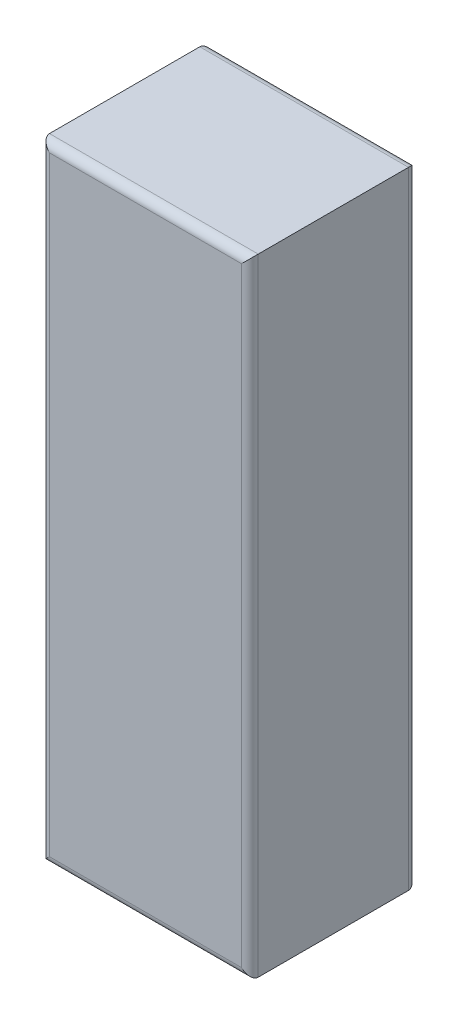
ISO-10303-21;
HEADER;
FILE_DESCRIPTION(('STEP AP214'),'2;1');
FILE_NAME('part.step','',(''),(''),'','','');
FILE_SCHEMA(('AUTOMOTIVE_DESIGN { 1 0 10303 214 1 1 1 1 }'));
ENDSEC;
DATA;
#1=APPLICATION_CONTEXT('core data for automotive mechanical design processes');
#2=APPLICATION_PROTOCOL_DEFINITION('international standard','automotive_design',2000,#1);
#3=PRODUCT_CONTEXT('',#1,'mechanical');
#4=PRODUCT('Part','Part','',(#3));
#5=PRODUCT_RELATED_PRODUCT_CATEGORY('part','',(#4));
#6=PRODUCT_DEFINITION_FORMATION('','',#4);
#7=PRODUCT_DEFINITION_CONTEXT('part definition',#1,'design');
#8=PRODUCT_DEFINITION('design','',#6,#7);
#9=PRODUCT_DEFINITION_SHAPE('','',#8);
#10=(LENGTH_UNIT() NAMED_UNIT(*) SI_UNIT(.MILLI.,.METRE.));
#11=(NAMED_UNIT(*) PLANE_ANGLE_UNIT() SI_UNIT($,.RADIAN.));
#12=(NAMED_UNIT(*) SI_UNIT($,.STERADIAN.) SOLID_ANGLE_UNIT());
#13=UNCERTAINTY_MEASURE_WITH_UNIT(LENGTH_MEASURE(1.E-05),#10,'distance_accuracy_value','');
#14=(GEOMETRIC_REPRESENTATION_CONTEXT(3) GLOBAL_UNCERTAINTY_ASSIGNED_CONTEXT((#13)) GLOBAL_UNIT_ASSIGNED_CONTEXT((#10,
#11,#12)) REPRESENTATION_CONTEXT('',''));
#15=CARTESIAN_POINT('',(0.,0.,0.));
#16=DIRECTION('',(0.,0.,1.));
#17=DIRECTION('',(1.,0.,0.));
#18=AXIS2_PLACEMENT_3D('',#15,#16,#17);
#19=CARTESIAN_POINT('',(0.,150.,0.));
#20=DIRECTION('',(1.,0.,0.));
#21=DIRECTION('',(0.,0.,-1.));
#22=AXIS2_PLACEMENT_3D('',#19,#20,#21);
#23=PLANE('',#22);
#24=DIRECTION('',(0.,0.,1.));
#25=VECTOR('',#24,1.);
#26=CARTESIAN_POINT('',(0.,0.,0.));
#27=LINE('',#26,#25);
#28=CARTESIAN_POINT('',(0.,0.,-38.));
#29=VERTEX_POINT('',#28);
#30=CARTESIAN_POINT('',(0.,0.,-2.));
#31=VERTEX_POINT('',#30);
#32=EDGE_CURVE('E180',#29,#31,#27,.T.);
#33=ORIENTED_EDGE('',*,*,#32,.T.);
#34=DIRECTION('',(0.,-1.,0.));
#35=VECTOR('',#34,1.);
#36=CARTESIAN_POINT('',(0.,150.,-2.));
#37=LINE('',#36,#35);
#38=CARTESIAN_POINT('',(0.,150.,-2.));
#39=VERTEX_POINT('',#38);
#40=EDGE_CURVE('E114',#31,#39,#37,.F.);
#41=ORIENTED_EDGE('',*,*,#40,.T.);
#42=DIRECTION('',(0.,0.,1.));
#43=VECTOR('',#42,1.);
#44=CARTESIAN_POINT('',(0.,150.,0.));
#45=LINE('',#44,#43);
#46=CARTESIAN_POINT('',(0.,150.,-38.));
#47=VERTEX_POINT('',#46);
#48=EDGE_CURVE('E205',#47,#39,#45,.T.);
#49=ORIENTED_EDGE('',*,*,#48,.F.);
#50=DIRECTION('',(0.,-1.,0.));
#51=VECTOR('',#50,1.);
#52=CARTESIAN_POINT('',(0.,150.,-38.));
#53=LINE('',#52,#51);
#54=EDGE_CURVE('E136',#47,#29,#53,.T.);
#55=ORIENTED_EDGE('',*,*,#54,.T.);
#56=EDGE_LOOP('',(#33,#41,#49,#55));
#57=FACE_BOUND('',#56,.T.);
#58=ADVANCED_FACE('F41',(#57),#23,.F.);
#59=CARTESIAN_POINT('',(0.,150.,0.));
#60=DIRECTION('',(0.,0.,-1.));
#61=DIRECTION('',(-1.,0.,0.));
#62=AXIS2_PLACEMENT_3D('',#59,#60,#61);
#63=PLANE('',#62);
#64=DIRECTION('',(1.,0.,0.));
#65=VECTOR('',#64,1.);
#66=CARTESIAN_POINT('',(0.,148.,0.));
#67=LINE('',#66,#65);
#68=CARTESIAN_POINT('',(48.,148.,0.));
#69=VERTEX_POINT('',#68);
#70=CARTESIAN_POINT('',(2.,148.,0.));
#71=VERTEX_POINT('',#70);
#72=EDGE_CURVE('E133',#69,#71,#67,.F.);
#73=ORIENTED_EDGE('',*,*,#72,.T.);
#74=DIRECTION('',(0.,-1.,0.));
#75=VECTOR('',#74,1.);
#76=CARTESIAN_POINT('',(2.,150.,0.));
#77=LINE('',#76,#75);
#78=CARTESIAN_POINT('',(2.,2.,0.));
#79=VERTEX_POINT('',#78);
#80=EDGE_CURVE('E112',#71,#79,#77,.T.);
#81=ORIENTED_EDGE('',*,*,#80,.T.);
#82=DIRECTION('',(1.,0.,0.));
#83=VECTOR('',#82,1.);
#84=CARTESIAN_POINT('',(50.,2.,0.));
#85=LINE('',#84,#83);
#86=CARTESIAN_POINT('',(48.,2.,0.));
#87=VERTEX_POINT('',#86);
#88=EDGE_CURVE('E121',#79,#87,#85,.T.);
#89=ORIENTED_EDGE('',*,*,#88,.T.);
#90=DIRECTION('',(0.,-1.,0.));
#91=VECTOR('',#90,1.);
#92=CARTESIAN_POINT('',(48.,150.,0.));
#93=LINE('',#92,#91);
#94=EDGE_CURVE('E128',#87,#69,#93,.F.);
#95=ORIENTED_EDGE('',*,*,#94,.T.);
#96=EDGE_LOOP('',(#73,#81,#89,#95));
#97=FACE_BOUND('',#96,.T.);
#98=ADVANCED_FACE('F131',(#97),#63,.F.);
#99=CARTESIAN_POINT('',(50.,150.,0.));
#100=DIRECTION('',(-1.,0.,0.));
#101=DIRECTION('',(0.,0.,1.));
#102=AXIS2_PLACEMENT_3D('',#99,#100,#101);
#103=PLANE('',#102);
#104=DIRECTION('',(0.,0.,-1.));
#105=VECTOR('',#104,1.);
#106=CARTESIAN_POINT('',(50.,150.,0.));
#107=LINE('',#106,#105);
#108=CARTESIAN_POINT('',(50.,150.,-2.));
#109=VERTEX_POINT('',#108);
#110=CARTESIAN_POINT('',(50.,150.,-38.));
#111=VERTEX_POINT('',#110);
#112=EDGE_CURVE('E129',#109,#111,#107,.T.);
#113=ORIENTED_EDGE('',*,*,#112,.F.);
#114=DIRECTION('',(0.,-1.,0.));
#115=VECTOR('',#114,1.);
#116=CARTESIAN_POINT('',(50.,150.,-2.));
#117=LINE('',#116,#115);
#118=CARTESIAN_POINT('',(50.,0.,-2.));
#119=VERTEX_POINT('',#118);
#120=EDGE_CURVE('E156',#109,#119,#117,.T.);
#121=ORIENTED_EDGE('',*,*,#120,.T.);
#122=DIRECTION('',(0.,0.,-1.));
#123=VECTOR('',#122,1.);
#124=CARTESIAN_POINT('',(50.,0.,0.));
#125=LINE('',#124,#123);
#126=CARTESIAN_POINT('',(50.,0.,-38.));
#127=VERTEX_POINT('',#126);
#128=EDGE_CURVE('E211',#119,#127,#125,.T.);
#129=ORIENTED_EDGE('',*,*,#128,.T.);
#130=DIRECTION('',(0.,-1.,0.));
#131=VECTOR('',#130,1.);
#132=CARTESIAN_POINT('',(50.,150.,-38.));
#133=LINE('',#132,#131);
#134=EDGE_CURVE('E152',#127,#111,#133,.F.);
#135=ORIENTED_EDGE('',*,*,#134,.T.);
#136=EDGE_LOOP('',(#113,#121,#129,#135));
#137=FACE_BOUND('',#136,.T.);
#138=ADVANCED_FACE('F232',(#137),#103,.F.);
#139=CARTESIAN_POINT('',(0.,150.,-40.));
#140=DIRECTION('',(0.,0.,1.));
#141=DIRECTION('',(1.,0.,0.));
#142=AXIS2_PLACEMENT_3D('',#139,#140,#141);
#143=PLANE('',#142);
#144=DIRECTION('',(-1.,0.,0.));
#145=VECTOR('',#144,1.);
#146=CARTESIAN_POINT('',(0.,148.,-40.));
#147=LINE('',#146,#145);
#148=CARTESIAN_POINT('',(1.99999999999999,148.,-40.));
#149=VERTEX_POINT('',#148);
#150=CARTESIAN_POINT('',(48.,148.,-40.));
#151=VERTEX_POINT('',#150);
#152=EDGE_CURVE('E51',#149,#151,#147,.F.);
#153=ORIENTED_EDGE('',*,*,#152,.T.);
#154=DIRECTION('',(0.,-1.,0.));
#155=VECTOR('',#154,1.);
#156=CARTESIAN_POINT('',(48.,150.,-40.));
#157=LINE('',#156,#155);
#158=CARTESIAN_POINT('',(48.,2.,-40.));
#159=VERTEX_POINT('',#158);
#160=EDGE_CURVE('E11',#151,#159,#157,.T.);
#161=ORIENTED_EDGE('',*,*,#160,.T.);
#162=DIRECTION('',(-1.,0.,0.));
#163=VECTOR('',#162,1.);
#164=CARTESIAN_POINT('',(0.,2.,-40.));
#165=LINE('',#164,#163);
#166=CARTESIAN_POINT('',(1.99999999999999,2.,-40.));
#167=VERTEX_POINT('',#166);
#168=EDGE_CURVE('E165',#159,#167,#165,.T.);
#169=ORIENTED_EDGE('',*,*,#168,.T.);
#170=DIRECTION('',(0.,-1.,0.));
#171=VECTOR('',#170,1.);
#172=CARTESIAN_POINT('',(1.99999999999999,150.,-40.));
#173=LINE('',#172,#171);
#174=EDGE_CURVE('E62',#167,#149,#173,.F.);
#175=ORIENTED_EDGE('',*,*,#174,.T.);
#176=EDGE_LOOP('',(#153,#161,#169,#175));
#177=FACE_BOUND('',#176,.T.);
#178=ADVANCED_FACE('F239',(#177),#143,.F.);
#179=CARTESIAN_POINT('',(0.,150.,0.));
#180=DIRECTION('',(0.,-1.,0.));
#181=DIRECTION('',(0.,0.,-1.));
#182=AXIS2_PLACEMENT_3D('',#179,#180,#181);
#183=PLANE('',#182);
#184=ORIENTED_EDGE('',*,*,#48,.T.);
#185=DIRECTION('',(1.,0.,0.));
#186=VECTOR('',#185,1.);
#187=CARTESIAN_POINT('',(0.,150.,-2.));
#188=LINE('',#187,#186);
#189=EDGE_CURVE('E149',#39,#109,#188,.T.);
#190=ORIENTED_EDGE('',*,*,#189,.T.);
#191=ORIENTED_EDGE('',*,*,#112,.T.);
#192=DIRECTION('',(-1.,0.,0.));
#193=VECTOR('',#192,1.);
#194=CARTESIAN_POINT('',(0.,150.,-38.));
#195=LINE('',#194,#193);
#196=EDGE_CURVE('E146',#111,#47,#195,.T.);
#197=ORIENTED_EDGE('',*,*,#196,.T.);
#198=EDGE_LOOP('',(#184,#190,#191,#197));
#199=FACE_BOUND('',#198,.T.);
#200=ADVANCED_FACE('F228',(#199),#183,.F.);
#201=CARTESIAN_POINT('',(0.,0.,0.));
#202=DIRECTION('',(0.,-1.,0.));
#203=DIRECTION('',(0.,0.,-1.));
#204=AXIS2_PLACEMENT_3D('',#201,#202,#203);
#205=PLANE('',#204);
#206=ORIENTED_EDGE('',*,*,#128,.F.);
#207=DIRECTION('',(1.,0.,0.));
#208=VECTOR('',#207,1.);
#209=CARTESIAN_POINT('',(0.,0.,-2.));
#210=LINE('',#209,#208);
#211=EDGE_CURVE('E162',#119,#31,#210,.F.);
#212=ORIENTED_EDGE('',*,*,#211,.T.);
#213=ORIENTED_EDGE('',*,*,#32,.F.);
#214=DIRECTION('',(-1.,0.,0.));
#215=VECTOR('',#214,1.);
#216=CARTESIAN_POINT('',(50.,0.,-38.));
#217=LINE('',#216,#215);
#218=EDGE_CURVE('E159',#29,#127,#217,.F.);
#219=ORIENTED_EDGE('',*,*,#218,.T.);
#220=EDGE_LOOP('',(#206,#212,#213,#219));
#221=FACE_BOUND('',#220,.T.);
#222=ADVANCED_FACE('F208',(#221),#205,.T.);
#223=CARTESIAN_POINT('',(48.,150.,-2.));
#224=DIRECTION('',(0.,-1.,0.));
#225=DIRECTION('',(0.,0.,-1.));
#226=AXIS2_PLACEMENT_3D('',#223,#224,#225);
#227=CYLINDRICAL_SURFACE('',#226,2.);
#228=CARTESIAN_POINT('',(48.,2.,-2.));
#229=DIRECTION('',(-0.707106781186547,-0.707106781186547,0.));
#230=DIRECTION('',(-0.707106781186547,0.707106781186547,0.));
#231=AXIS2_PLACEMENT_3D('',#228,#229,#230);
#232=ELLIPSE('',#231,2.82842712474619,2.);
#233=EDGE_CURVE('E124',#119,#87,#232,.T.);
#234=ORIENTED_EDGE('',*,*,#233,.F.);
#235=ORIENTED_EDGE('',*,*,#120,.F.);
#236=CARTESIAN_POINT('',(48.,148.,-2.));
#237=DIRECTION('',(0.707106781186547,-0.707106781186547,0.));
#238=DIRECTION('',(-0.707106781186547,-0.707106781186547,0.));
#239=AXIS2_PLACEMENT_3D('',#236,#237,#238);
#240=ELLIPSE('',#239,2.82842712474619,2.);
#241=EDGE_CURVE('E176',#69,#109,#240,.F.);
#242=ORIENTED_EDGE('',*,*,#241,.F.);
#243=ORIENTED_EDGE('',*,*,#94,.F.);
#244=EDGE_LOOP('',(#234,#235,#242,#243));
#245=FACE_BOUND('',#244,.T.);
#246=ADVANCED_FACE('F221',(#245),#227,.T.);
#247=CARTESIAN_POINT('',(0.,148.,-2.));
#248=DIRECTION('',(1.,0.,0.));
#249=DIRECTION('',(0.,0.,-1.));
#250=AXIS2_PLACEMENT_3D('',#247,#248,#249);
#251=CYLINDRICAL_SURFACE('',#250,2.);
#252=ORIENTED_EDGE('',*,*,#241,.T.);
#253=ORIENTED_EDGE('',*,*,#189,.F.);
#254=CARTESIAN_POINT('',(2.,148.,-2.));
#255=DIRECTION('',(0.707106781186547,0.707106781186547,0.));
#256=DIRECTION('',(0.707106781186547,-0.707106781186547,0.));
#257=AXIS2_PLACEMENT_3D('',#254,#255,#256);
#258=ELLIPSE('',#257,2.82842712474619,2.);
#259=EDGE_CURVE('E118',#71,#39,#258,.F.);
#260=ORIENTED_EDGE('',*,*,#259,.F.);
#261=ORIENTED_EDGE('',*,*,#72,.F.);
#262=EDGE_LOOP('',(#252,#253,#260,#261));
#263=FACE_BOUND('',#262,.T.);
#264=ADVANCED_FACE('F224',(#263),#251,.T.);
#265=CARTESIAN_POINT('',(0.,2.,-2.));
#266=DIRECTION('',(-1.,0.,0.));
#267=DIRECTION('',(0.,0.,1.));
#268=AXIS2_PLACEMENT_3D('',#265,#266,#267);
#269=CYLINDRICAL_SURFACE('',#268,2.);
#270=ORIENTED_EDGE('',*,*,#233,.T.);
#271=ORIENTED_EDGE('',*,*,#88,.F.);
#272=CARTESIAN_POINT('',(2.,2.,-2.));
#273=DIRECTION('',(-0.707106781186547,0.707106781186547,0.));
#274=DIRECTION('',(-0.707106781186547,-0.707106781186547,0.));
#275=AXIS2_PLACEMENT_3D('',#272,#273,#274);
#276=ELLIPSE('',#275,2.82842712474619,2.);
#277=EDGE_CURVE('E108',#31,#79,#276,.T.);
#278=ORIENTED_EDGE('',*,*,#277,.F.);
#279=ORIENTED_EDGE('',*,*,#211,.F.);
#280=EDGE_LOOP('',(#270,#271,#278,#279));
#281=FACE_BOUND('',#280,.T.);
#282=ADVANCED_FACE('F122',(#281),#269,.T.);
#283=CARTESIAN_POINT('',(2.,150.,-2.));
#284=DIRECTION('',(0.,-1.,0.));
#285=DIRECTION('',(0.,0.,-1.));
#286=AXIS2_PLACEMENT_3D('',#283,#284,#285);
#287=CYLINDRICAL_SURFACE('',#286,2.);
#288=ORIENTED_EDGE('',*,*,#259,.T.);
#289=ORIENTED_EDGE('',*,*,#40,.F.);
#290=ORIENTED_EDGE('',*,*,#277,.T.);
#291=ORIENTED_EDGE('',*,*,#80,.F.);
#292=EDGE_LOOP('',(#288,#289,#290,#291));
#293=FACE_BOUND('',#292,.T.);
#294=ADVANCED_FACE('F110',(#293),#287,.T.);
#295=CARTESIAN_POINT('',(1.99999999999999,150.,-38.));
#296=DIRECTION('',(0.,-1.,0.));
#297=DIRECTION('',(0.,0.,-1.));
#298=AXIS2_PLACEMENT_3D('',#295,#296,#297);
#299=CYLINDRICAL_SURFACE('',#298,2.);
#300=CARTESIAN_POINT('',(1.99999999999999,2.,-38.));
#301=DIRECTION('',(0.707106781186547,-0.707106781186547,0.));
#302=DIRECTION('',(0.707106781186547,0.707106781186547,0.));
#303=AXIS2_PLACEMENT_3D('',#300,#301,#302);
#304=ELLIPSE('',#303,2.82842712474619,2.);
#305=EDGE_CURVE('E186',#29,#167,#304,.T.);
#306=ORIENTED_EDGE('',*,*,#305,.F.);
#307=ORIENTED_EDGE('',*,*,#54,.F.);
#308=CARTESIAN_POINT('',(1.99999999999999,148.,-38.));
#309=DIRECTION('',(-0.707106781186547,-0.707106781186547,0.));
#310=DIRECTION('',(0.707106781186547,-0.707106781186547,0.));
#311=AXIS2_PLACEMENT_3D('',#308,#309,#310);
#312=ELLIPSE('',#311,2.82842712474619,2.);
#313=EDGE_CURVE('E45',#149,#47,#312,.F.);
#314=ORIENTED_EDGE('',*,*,#313,.F.);
#315=ORIENTED_EDGE('',*,*,#174,.F.);
#316=EDGE_LOOP('',(#306,#307,#314,#315));
#317=FACE_BOUND('',#316,.T.);
#318=ADVANCED_FACE('F43',(#317),#299,.T.);
#319=CARTESIAN_POINT('',(0.,148.,-38.));
#320=DIRECTION('',(-1.,0.,0.));
#321=DIRECTION('',(0.,0.,1.));
#322=AXIS2_PLACEMENT_3D('',#319,#320,#321);
#323=CYLINDRICAL_SURFACE('',#322,2.);
#324=ORIENTED_EDGE('',*,*,#313,.T.);
#325=ORIENTED_EDGE('',*,*,#196,.F.);
#326=CARTESIAN_POINT('',(48.,148.,-38.));
#327=DIRECTION('',(-0.707106781186547,0.707106781186547,0.));
#328=DIRECTION('',(-0.707106781186547,-0.707106781186547,0.));
#329=AXIS2_PLACEMENT_3D('',#326,#327,#328);
#330=ELLIPSE('',#329,2.82842712474619,2.);
#331=EDGE_CURVE('E184',#151,#111,#330,.F.);
#332=ORIENTED_EDGE('',*,*,#331,.F.);
#333=ORIENTED_EDGE('',*,*,#152,.F.);
#334=EDGE_LOOP('',(#324,#325,#332,#333));
#335=FACE_BOUND('',#334,.T.);
#336=ADVANCED_FACE('F197',(#335),#323,.T.);
#337=CARTESIAN_POINT('',(0.,2.,-38.));
#338=DIRECTION('',(1.,0.,0.));
#339=DIRECTION('',(0.,0.,-1.));
#340=AXIS2_PLACEMENT_3D('',#337,#338,#339);
#341=CYLINDRICAL_SURFACE('',#340,2.);
#342=ORIENTED_EDGE('',*,*,#305,.T.);
#343=ORIENTED_EDGE('',*,*,#168,.F.);
#344=CARTESIAN_POINT('',(48.,2.,-38.));
#345=DIRECTION('',(0.707106781186547,0.707106781186547,0.));
#346=DIRECTION('',(0.707106781186547,-0.707106781186547,0.));
#347=AXIS2_PLACEMENT_3D('',#344,#345,#346);
#348=ELLIPSE('',#347,2.82842712474619,2.);
#349=EDGE_CURVE('E181',#127,#159,#348,.T.);
#350=ORIENTED_EDGE('',*,*,#349,.F.);
#351=ORIENTED_EDGE('',*,*,#218,.F.);
#352=EDGE_LOOP('',(#342,#343,#350,#351));
#353=FACE_BOUND('',#352,.T.);
#354=ADVANCED_FACE('F238',(#353),#341,.T.);
#355=CARTESIAN_POINT('',(48.,150.,-38.));
#356=DIRECTION('',(0.,-1.,0.));
#357=DIRECTION('',(0.,0.,-1.));
#358=AXIS2_PLACEMENT_3D('',#355,#356,#357);
#359=CYLINDRICAL_SURFACE('',#358,2.);
#360=ORIENTED_EDGE('',*,*,#331,.T.);
#361=ORIENTED_EDGE('',*,*,#134,.F.);
#362=ORIENTED_EDGE('',*,*,#349,.T.);
#363=ORIENTED_EDGE('',*,*,#160,.F.);
#364=EDGE_LOOP('',(#360,#361,#362,#363));
#365=FACE_BOUND('',#364,.T.);
#366=ADVANCED_FACE('F236',(#365),#359,.T.);
#367=CLOSED_SHELL('',(#58,#98,#138,#178,#200,#222,#246,#264,#282,#294,#318,#336,#354,#366));
#368=MANIFOLD_SOLID_BREP('B2',#367);
#369=ADVANCED_BREP_SHAPE_REPRESENTATION('',(#18,#368),#14);
#370=SHAPE_DEFINITION_REPRESENTATION(#9,#369);
ENDSEC;
END-ISO-10303-21;
